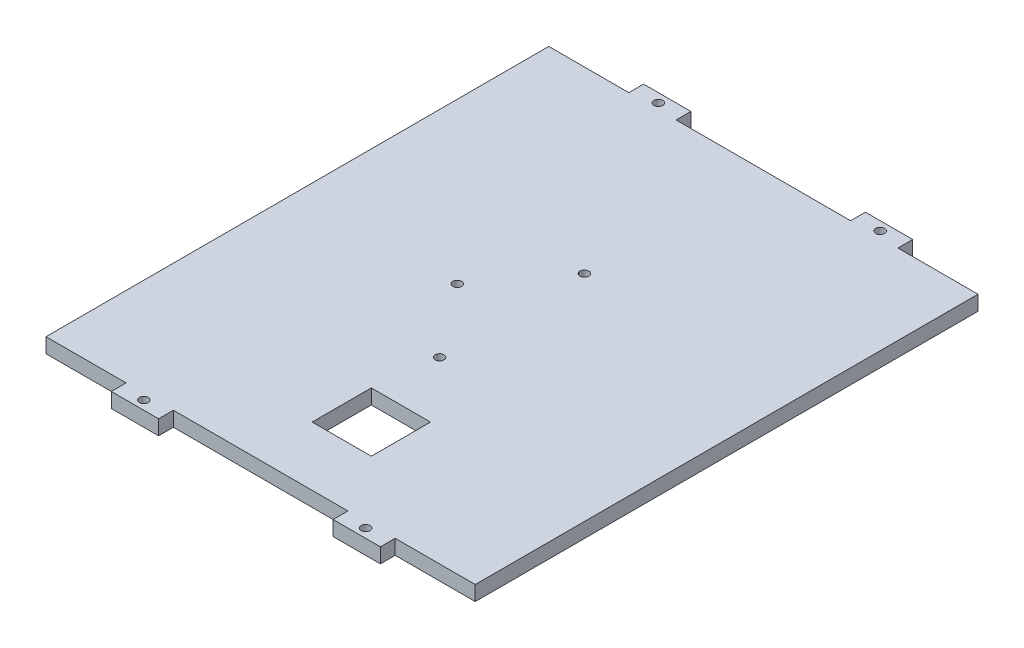
ISO-10303-21;
HEADER;
FILE_DESCRIPTION(('STEP AP214'),'2;1');
FILE_NAME('part.step','',(''),(''),'','','');
FILE_SCHEMA(('AUTOMOTIVE_DESIGN { 1 0 10303 214 1 1 1 1 }'));
ENDSEC;
DATA;
#1=APPLICATION_CONTEXT('core data for automotive mechanical design processes');
#2=APPLICATION_PROTOCOL_DEFINITION('international standard','automotive_design',2000,#1);
#3=PRODUCT_CONTEXT('',#1,'mechanical');
#4=PRODUCT('Part','Part','',(#3));
#5=PRODUCT_RELATED_PRODUCT_CATEGORY('part','',(#4));
#6=PRODUCT_DEFINITION_FORMATION('','',#4);
#7=PRODUCT_DEFINITION_CONTEXT('part definition',#1,'design');
#8=PRODUCT_DEFINITION('design','',#6,#7);
#9=PRODUCT_DEFINITION_SHAPE('','',#8);
#10=(LENGTH_UNIT() NAMED_UNIT(*) SI_UNIT(.MILLI.,.METRE.));
#11=(NAMED_UNIT(*) PLANE_ANGLE_UNIT() SI_UNIT($,.RADIAN.));
#12=(NAMED_UNIT(*) SI_UNIT($,.STERADIAN.) SOLID_ANGLE_UNIT());
#13=UNCERTAINTY_MEASURE_WITH_UNIT(LENGTH_MEASURE(1.E-05),#10,'distance_accuracy_value','');
#14=(GEOMETRIC_REPRESENTATION_CONTEXT(3) GLOBAL_UNCERTAINTY_ASSIGNED_CONTEXT((#13)) GLOBAL_UNIT_ASSIGNED_CONTEXT((#10,
#11,#12)) REPRESENTATION_CONTEXT('',''));
#15=CARTESIAN_POINT('',(0.,0.,0.));
#16=DIRECTION('',(0.,0.,1.));
#17=DIRECTION('',(1.,0.,0.));
#18=AXIS2_PLACEMENT_3D('',#15,#16,#17);
#19=CARTESIAN_POINT('',(0.,5.,0.));
#20=DIRECTION('',(0.,1.,0.));
#21=DIRECTION('',(0.,0.,1.));
#22=AXIS2_PLACEMENT_3D('',#19,#20,#21);
#23=PLANE('',#22);
#24=DIRECTION('',(0.,0.,1.));
#25=VECTOR('',#24,1.);
#26=CARTESIAN_POINT('',(-2.56999999999999,5.,45.));
#27=LINE('',#26,#25);
#28=CARTESIAN_POINT('',(-2.56999999999999,5.,45.));
#29=VERTEX_POINT('',#28);
#30=CARTESIAN_POINT('',(-2.56999999999999,5.,65.));
#31=VERTEX_POINT('',#30);
#32=EDGE_CURVE('E55',#29,#31,#27,.T.);
#33=ORIENTED_EDGE('',*,*,#32,.F.);
#34=DIRECTION('',(-1.,0.,0.));
#35=VECTOR('',#34,1.);
#36=CARTESIAN_POINT('',(-2.56999999999999,5.,45.));
#37=LINE('',#36,#35);
#38=CARTESIAN_POINT('',(17.43,5.,45.));
#39=VERTEX_POINT('',#38);
#40=EDGE_CURVE('E219',#39,#29,#37,.T.);
#41=ORIENTED_EDGE('',*,*,#40,.F.);
#42=DIRECTION('',(0.,0.,-1.));
#43=VECTOR('',#42,1.);
#44=CARTESIAN_POINT('',(17.43,5.,45.));
#45=LINE('',#44,#43);
#46=CARTESIAN_POINT('',(17.43,5.,65.));
#47=VERTEX_POINT('',#46);
#48=EDGE_CURVE('E222',#47,#39,#45,.T.);
#49=ORIENTED_EDGE('',*,*,#48,.F.);
#50=DIRECTION('',(1.,0.,0.));
#51=VECTOR('',#50,1.);
#52=CARTESIAN_POINT('',(-2.56999999999999,5.,65.));
#53=LINE('',#52,#51);
#54=EDGE_CURVE('E228',#31,#47,#53,.T.);
#55=ORIENTED_EDGE('',*,*,#54,.F.);
#56=EDGE_LOOP('',(#33,#41,#49,#55));
#57=FACE_BOUND('',#56,.T.);
#58=CARTESIAN_POINT('',(0.,5.,-24.5));
#59=DIRECTION('',(0.,1.,0.));
#60=DIRECTION('',(0.,0.,1.));
#61=AXIS2_PLACEMENT_3D('',#58,#59,#60);
#62=CIRCLE('',#61,1.5);
#63=CARTESIAN_POINT('',(0.,5.,-23.));
#64=VERTEX_POINT('',#63);
#65=EDGE_CURVE('E242',#64,#64,#62,.T.);
#66=ORIENTED_EDGE('',*,*,#65,.F.);
#67=EDGE_LOOP('',(#66));
#68=FACE_BOUND('',#67,.T.);
#69=CARTESIAN_POINT('',(0.,5.,24.5));
#70=DIRECTION('',(0.,1.,0.));
#71=DIRECTION('',(0.,0.,1.));
#72=AXIS2_PLACEMENT_3D('',#69,#70,#71);
#73=CIRCLE('',#72,1.5);
#74=CARTESIAN_POINT('',(0.,5.,26.));
#75=VERTEX_POINT('',#74);
#76=EDGE_CURVE('E248',#75,#75,#73,.T.);
#77=ORIENTED_EDGE('',*,*,#76,.F.);
#78=EDGE_LOOP('',(#77));
#79=FACE_BOUND('',#78,.T.);
#80=CARTESIAN_POINT('',(-18.5,5.,0.));
#81=DIRECTION('',(0.,1.,0.));
#82=DIRECTION('',(0.,0.,1.));
#83=AXIS2_PLACEMENT_3D('',#80,#81,#82);
#84=CIRCLE('',#83,1.5);
#85=CARTESIAN_POINT('',(-18.5,5.,1.5));
#86=VERTEX_POINT('',#85);
#87=EDGE_CURVE('E234',#86,#86,#84,.T.);
#88=ORIENTED_EDGE('',*,*,#87,.F.);
#89=EDGE_LOOP('',(#88));
#90=FACE_BOUND('',#89,.T.);
#91=CARTESIAN_POINT('',(-37.5,5.,87.));
#92=DIRECTION('',(0.,-1.,0.));
#93=DIRECTION('',(0.,0.,-1.));
#94=AXIS2_PLACEMENT_3D('',#91,#92,#93);
#95=CIRCLE('',#94,1.5);
#96=CARTESIAN_POINT('',(-37.5,5.,85.5));
#97=VERTEX_POINT('',#96);
#98=EDGE_CURVE('E241',#97,#97,#95,.T.);
#99=ORIENTED_EDGE('',*,*,#98,.T.);
#100=EDGE_LOOP('',(#99));
#101=FACE_BOUND('',#100,.T.);
#102=CARTESIAN_POINT('',(37.5,5.,87.));
#103=DIRECTION('',(0.,1.,0.));
#104=DIRECTION('',(0.,0.,-1.));
#105=AXIS2_PLACEMENT_3D('',#102,#103,#104);
#106=CIRCLE('',#105,1.5);
#107=CARTESIAN_POINT('',(37.5,5.,85.5));
#108=VERTEX_POINT('',#107);
#109=EDGE_CURVE('E259',#108,#108,#106,.T.);
#110=ORIENTED_EDGE('',*,*,#109,.F.);
#111=EDGE_LOOP('',(#110));
#112=FACE_BOUND('',#111,.T.);
#113=CARTESIAN_POINT('',(37.5,5.,-87.));
#114=DIRECTION('',(0.,-1.,0.));
#115=DIRECTION('',(0.,0.,1.));
#116=AXIS2_PLACEMENT_3D('',#113,#114,#115);
#117=CIRCLE('',#116,1.5);
#118=CARTESIAN_POINT('',(37.5,5.,-85.5));
#119=VERTEX_POINT('',#118);
#120=EDGE_CURVE('E265',#119,#119,#117,.T.);
#121=ORIENTED_EDGE('',*,*,#120,.T.);
#122=EDGE_LOOP('',(#121));
#123=FACE_BOUND('',#122,.T.);
#124=CARTESIAN_POINT('',(-37.5,5.,-87.));
#125=DIRECTION('',(0.,1.,0.));
#126=DIRECTION('',(0.,0.,1.));
#127=AXIS2_PLACEMENT_3D('',#124,#125,#126);
#128=CIRCLE('',#127,1.5);
#129=CARTESIAN_POINT('',(-37.5,5.,-85.5));
#130=VERTEX_POINT('',#129);
#131=EDGE_CURVE('E271',#130,#130,#128,.T.);
#132=ORIENTED_EDGE('',*,*,#131,.F.);
#133=EDGE_LOOP('',(#132));
#134=FACE_BOUND('',#133,.T.);
#135=DIRECTION('',(1.,0.,0.));
#136=VECTOR('',#135,1.);
#137=CARTESIAN_POINT('',(72.57,5.,90.));
#138=LINE('',#137,#136);
#139=CARTESIAN_POINT('',(29.5,5.,90.));
#140=VERTEX_POINT('',#139);
#141=CARTESIAN_POINT('',(45.5,5.,90.));
#142=VERTEX_POINT('',#141);
#143=EDGE_CURVE('E410',#140,#142,#138,.T.);
#144=ORIENTED_EDGE('',*,*,#143,.T.);
#145=DIRECTION('',(0.,0.,-1.));
#146=VECTOR('',#145,1.);
#147=CARTESIAN_POINT('',(45.5,5.,0.));
#148=LINE('',#147,#146);
#149=CARTESIAN_POINT('',(45.5,5.,85.));
#150=VERTEX_POINT('',#149);
#151=EDGE_CURVE('E277',#142,#150,#148,.T.);
#152=ORIENTED_EDGE('',*,*,#151,.T.);
#153=DIRECTION('',(1.,0.,0.));
#154=VECTOR('',#153,1.);
#155=CARTESIAN_POINT('',(0.,5.,85.));
#156=LINE('',#155,#154);
#157=CARTESIAN_POINT('',(72.57,5.,85.));
#158=VERTEX_POINT('',#157);
#159=EDGE_CURVE('E303',#150,#158,#156,.T.);
#160=ORIENTED_EDGE('',*,*,#159,.T.);
#161=DIRECTION('',(0.,0.,-1.));
#162=VECTOR('',#161,1.);
#163=CARTESIAN_POINT('',(72.57,5.,90.));
#164=LINE('',#163,#162);
#165=CARTESIAN_POINT('',(72.57,5.,-85.));
#166=VERTEX_POINT('',#165);
#167=EDGE_CURVE('E415',#158,#166,#164,.T.);
#168=ORIENTED_EDGE('',*,*,#167,.T.);
#169=DIRECTION('',(1.,0.,0.));
#170=VECTOR('',#169,1.);
#171=CARTESIAN_POINT('',(0.,5.,-85.));
#172=LINE('',#171,#170);
#173=CARTESIAN_POINT('',(45.5,5.,-85.));
#174=VERTEX_POINT('',#173);
#175=EDGE_CURVE('E367',#174,#166,#172,.T.);
#176=ORIENTED_EDGE('',*,*,#175,.F.);
#177=DIRECTION('',(0.,0.,1.));
#178=VECTOR('',#177,1.);
#179=CARTESIAN_POINT('',(45.5,5.,0.));
#180=LINE('',#179,#178);
#181=CARTESIAN_POINT('',(45.5,5.,-90.));
#182=VERTEX_POINT('',#181);
#183=EDGE_CURVE('E335',#182,#174,#180,.T.);
#184=ORIENTED_EDGE('',*,*,#183,.F.);
#185=DIRECTION('',(-1.,0.,0.));
#186=VECTOR('',#185,1.);
#187=CARTESIAN_POINT('',(72.57,5.,-90.));
#188=LINE('',#187,#186);
#189=CARTESIAN_POINT('',(29.5,5.,-90.));
#190=VERTEX_POINT('',#189);
#191=EDGE_CURVE('E11',#182,#190,#188,.T.);
#192=ORIENTED_EDGE('',*,*,#191,.T.);
#193=DIRECTION('',(0.,0.,1.));
#194=VECTOR('',#193,1.);
#195=CARTESIAN_POINT('',(29.5,5.,0.));
#196=LINE('',#195,#194);
#197=CARTESIAN_POINT('',(29.5,5.,-85.));
#198=VERTEX_POINT('',#197);
#199=EDGE_CURVE('E384',#190,#198,#196,.T.);
#200=ORIENTED_EDGE('',*,*,#199,.T.);
#201=DIRECTION('',(1.,0.,0.));
#202=VECTOR('',#201,1.);
#203=CARTESIAN_POINT('',(0.,5.,-85.));
#204=LINE('',#203,#202);
#205=CARTESIAN_POINT('',(-29.5,5.,-85.));
#206=VERTEX_POINT('',#205);
#207=EDGE_CURVE('E393',#206,#198,#204,.T.);
#208=ORIENTED_EDGE('',*,*,#207,.F.);
#209=DIRECTION('',(0.,0.,1.));
#210=VECTOR('',#209,1.);
#211=CARTESIAN_POINT('',(-29.5,5.,0.));
#212=LINE('',#211,#210);
#213=CARTESIAN_POINT('',(-29.5,5.,-90.));
#214=VERTEX_POINT('',#213);
#215=EDGE_CURVE('E359',#214,#206,#212,.T.);
#216=ORIENTED_EDGE('',*,*,#215,.F.);
#217=CARTESIAN_POINT('',(-45.5,5.,-90.));
#218=VERTEX_POINT('',#217);
#219=EDGE_CURVE('E47',#214,#218,#188,.T.);
#220=ORIENTED_EDGE('',*,*,#219,.T.);
#221=DIRECTION('',(0.,0.,1.));
#222=VECTOR('',#221,1.);
#223=CARTESIAN_POINT('',(-45.5,5.,0.));
#224=LINE('',#223,#222);
#225=CARTESIAN_POINT('',(-45.5,5.,-85.));
#226=VERTEX_POINT('',#225);
#227=EDGE_CURVE('E346',#218,#226,#224,.T.);
#228=ORIENTED_EDGE('',*,*,#227,.T.);
#229=DIRECTION('',(1.,0.,0.));
#230=VECTOR('',#229,1.);
#231=CARTESIAN_POINT('',(0.,5.,-85.));
#232=LINE('',#231,#230);
#233=CARTESIAN_POINT('',(-72.57,5.,-85.));
#234=VERTEX_POINT('',#233);
#235=EDGE_CURVE('E350',#234,#226,#232,.T.);
#236=ORIENTED_EDGE('',*,*,#235,.F.);
#237=DIRECTION('',(0.,0.,1.));
#238=VECTOR('',#237,1.);
#239=CARTESIAN_POINT('',(-72.57,5.,90.));
#240=LINE('',#239,#238);
#241=CARTESIAN_POINT('',(-72.57,5.,85.));
#242=VERTEX_POINT('',#241);
#243=EDGE_CURVE('E407',#234,#242,#240,.T.);
#244=ORIENTED_EDGE('',*,*,#243,.T.);
#245=DIRECTION('',(1.,0.,0.));
#246=VECTOR('',#245,1.);
#247=CARTESIAN_POINT('',(0.,5.,85.));
#248=LINE('',#247,#246);
#249=CARTESIAN_POINT('',(-45.5,5.,85.));
#250=VERTEX_POINT('',#249);
#251=EDGE_CURVE('E284',#242,#250,#248,.T.);
#252=ORIENTED_EDGE('',*,*,#251,.T.);
#253=DIRECTION('',(0.,0.,-1.));
#254=VECTOR('',#253,1.);
#255=CARTESIAN_POINT('',(-45.5,5.,0.));
#256=LINE('',#255,#254);
#257=CARTESIAN_POINT('',(-45.5,5.,90.));
#258=VERTEX_POINT('',#257);
#259=EDGE_CURVE('E287',#258,#250,#256,.T.);
#260=ORIENTED_EDGE('',*,*,#259,.F.);
#261=CARTESIAN_POINT('',(-29.5,5.,90.));
#262=VERTEX_POINT('',#261);
#263=EDGE_CURVE('E414',#258,#262,#138,.T.);
#264=ORIENTED_EDGE('',*,*,#263,.T.);
#265=DIRECTION('',(0.,0.,-1.));
#266=VECTOR('',#265,1.);
#267=CARTESIAN_POINT('',(-29.5,5.,0.));
#268=LINE('',#267,#266);
#269=CARTESIAN_POINT('',(-29.5,5.,85.));
#270=VERTEX_POINT('',#269);
#271=EDGE_CURVE('E296',#262,#270,#268,.T.);
#272=ORIENTED_EDGE('',*,*,#271,.T.);
#273=DIRECTION('',(1.,0.,0.));
#274=VECTOR('',#273,1.);
#275=CARTESIAN_POINT('',(0.,5.,85.));
#276=LINE('',#275,#274);
#277=CARTESIAN_POINT('',(29.5,5.,85.));
#278=VERTEX_POINT('',#277);
#279=EDGE_CURVE('E319',#270,#278,#276,.T.);
#280=ORIENTED_EDGE('',*,*,#279,.T.);
#281=DIRECTION('',(0.,0.,-1.));
#282=VECTOR('',#281,1.);
#283=CARTESIAN_POINT('',(29.5,5.,0.));
#284=LINE('',#283,#282);
#285=EDGE_CURVE('E327',#140,#278,#284,.T.);
#286=ORIENTED_EDGE('',*,*,#285,.F.);
#287=EDGE_LOOP('',(#144,#152,#160,#168,#176,#184,#192,#200,#208,#216,#220,#228,#236,#244,#252,
#260,#264,#272,#280,#286));
#288=FACE_BOUND('',#287,.T.);
#289=ADVANCED_FACE('F38',(#57,#68,#79,#90,#101,#112,#123,#134,#288),#23,.T.);
#290=CARTESIAN_POINT('',(0.,0.,0.));
#291=DIRECTION('',(0.,1.,0.));
#292=DIRECTION('',(0.,0.,1.));
#293=AXIS2_PLACEMENT_3D('',#290,#291,#292);
#294=PLANE('',#293);
#295=DIRECTION('',(-1.,0.,0.));
#296=VECTOR('',#295,1.);
#297=CARTESIAN_POINT('',(-2.56999999999999,0.,45.));
#298=LINE('',#297,#296);
#299=CARTESIAN_POINT('',(17.43,0.,45.));
#300=VERTEX_POINT('',#299);
#301=CARTESIAN_POINT('',(-2.56999999999999,0.,45.));
#302=VERTEX_POINT('',#301);
#303=EDGE_CURVE('E209',#300,#302,#298,.T.);
#304=ORIENTED_EDGE('',*,*,#303,.T.);
#305=DIRECTION('',(0.,0.,1.));
#306=VECTOR('',#305,1.);
#307=CARTESIAN_POINT('',(-2.56999999999999,0.,45.));
#308=LINE('',#307,#306);
#309=CARTESIAN_POINT('',(-2.56999999999999,0.,65.));
#310=VERTEX_POINT('',#309);
#311=EDGE_CURVE('E203',#302,#310,#308,.T.);
#312=ORIENTED_EDGE('',*,*,#311,.T.);
#313=DIRECTION('',(1.,0.,0.));
#314=VECTOR('',#313,1.);
#315=CARTESIAN_POINT('',(-2.56999999999999,0.,65.));
#316=LINE('',#315,#314);
#317=CARTESIAN_POINT('',(17.43,0.,65.));
#318=VERTEX_POINT('',#317);
#319=EDGE_CURVE('E212',#310,#318,#316,.T.);
#320=ORIENTED_EDGE('',*,*,#319,.T.);
#321=DIRECTION('',(0.,0.,-1.));
#322=VECTOR('',#321,1.);
#323=CARTESIAN_POINT('',(17.43,0.,45.));
#324=LINE('',#323,#322);
#325=EDGE_CURVE('E63',#318,#300,#324,.T.);
#326=ORIENTED_EDGE('',*,*,#325,.T.);
#327=EDGE_LOOP('',(#304,#312,#320,#326));
#328=FACE_BOUND('',#327,.T.);
#329=CARTESIAN_POINT('',(0.,0.,-24.5));
#330=DIRECTION('',(0.,1.,0.));
#331=DIRECTION('',(0.,0.,1.));
#332=AXIS2_PLACEMENT_3D('',#329,#330,#331);
#333=CIRCLE('',#332,1.5);
#334=CARTESIAN_POINT('',(0.,0.,-23.));
#335=VERTEX_POINT('',#334);
#336=EDGE_CURVE('E238',#335,#335,#333,.T.);
#337=ORIENTED_EDGE('',*,*,#336,.T.);
#338=EDGE_LOOP('',(#337));
#339=FACE_BOUND('',#338,.T.);
#340=CARTESIAN_POINT('',(0.,0.,24.5));
#341=DIRECTION('',(0.,1.,0.));
#342=DIRECTION('',(0.,0.,1.));
#343=AXIS2_PLACEMENT_3D('',#340,#341,#342);
#344=CIRCLE('',#343,1.5);
#345=CARTESIAN_POINT('',(0.,0.,26.));
#346=VERTEX_POINT('',#345);
#347=EDGE_CURVE('E245',#346,#346,#344,.T.);
#348=ORIENTED_EDGE('',*,*,#347,.T.);
#349=EDGE_LOOP('',(#348));
#350=FACE_BOUND('',#349,.T.);
#351=CARTESIAN_POINT('',(-18.5,0.,0.));
#352=DIRECTION('',(0.,1.,0.));
#353=DIRECTION('',(0.,0.,1.));
#354=AXIS2_PLACEMENT_3D('',#351,#352,#353);
#355=CIRCLE('',#354,1.5);
#356=CARTESIAN_POINT('',(-18.5,0.,1.5));
#357=VERTEX_POINT('',#356);
#358=EDGE_CURVE('E251',#357,#357,#355,.T.);
#359=ORIENTED_EDGE('',*,*,#358,.T.);
#360=EDGE_LOOP('',(#359));
#361=FACE_BOUND('',#360,.T.);
#362=CARTESIAN_POINT('',(-37.5,0.,87.));
#363=DIRECTION('',(0.,-1.,0.));
#364=DIRECTION('',(0.,0.,-1.));
#365=AXIS2_PLACEMENT_3D('',#362,#363,#364);
#366=CIRCLE('',#365,1.5);
#367=CARTESIAN_POINT('',(-37.5,0.,85.5));
#368=VERTEX_POINT('',#367);
#369=EDGE_CURVE('E256',#368,#368,#366,.T.);
#370=ORIENTED_EDGE('',*,*,#369,.F.);
#371=EDGE_LOOP('',(#370));
#372=FACE_BOUND('',#371,.T.);
#373=CARTESIAN_POINT('',(37.5,0.,87.));
#374=DIRECTION('',(0.,1.,0.));
#375=DIRECTION('',(0.,0.,-1.));
#376=AXIS2_PLACEMENT_3D('',#373,#374,#375);
#377=CIRCLE('',#376,1.5);
#378=CARTESIAN_POINT('',(37.5,0.,85.5));
#379=VERTEX_POINT('',#378);
#380=EDGE_CURVE('E262',#379,#379,#377,.T.);
#381=ORIENTED_EDGE('',*,*,#380,.T.);
#382=EDGE_LOOP('',(#381));
#383=FACE_BOUND('',#382,.T.);
#384=CARTESIAN_POINT('',(37.5,0.,-87.));
#385=DIRECTION('',(0.,-1.,0.));
#386=DIRECTION('',(0.,0.,1.));
#387=AXIS2_PLACEMENT_3D('',#384,#385,#386);
#388=CIRCLE('',#387,1.5);
#389=CARTESIAN_POINT('',(37.5,0.,-85.5));
#390=VERTEX_POINT('',#389);
#391=EDGE_CURVE('E268',#390,#390,#388,.T.);
#392=ORIENTED_EDGE('',*,*,#391,.F.);
#393=EDGE_LOOP('',(#392));
#394=FACE_BOUND('',#393,.T.);
#395=CARTESIAN_POINT('',(-37.5,0.,-87.));
#396=DIRECTION('',(0.,1.,0.));
#397=DIRECTION('',(0.,0.,1.));
#398=AXIS2_PLACEMENT_3D('',#395,#396,#397);
#399=CIRCLE('',#398,1.5);
#400=CARTESIAN_POINT('',(-37.5,0.,-85.5));
#401=VERTEX_POINT('',#400);
#402=EDGE_CURVE('E274',#401,#401,#399,.T.);
#403=ORIENTED_EDGE('',*,*,#402,.T.);
#404=EDGE_LOOP('',(#403));
#405=FACE_BOUND('',#404,.T.);
#406=DIRECTION('',(0.,0.,-1.));
#407=VECTOR('',#406,1.);
#408=CARTESIAN_POINT('',(45.5,0.,0.));
#409=LINE('',#408,#407);
#410=CARTESIAN_POINT('',(45.5,0.,90.));
#411=VERTEX_POINT('',#410);
#412=CARTESIAN_POINT('',(45.5,0.,85.));
#413=VERTEX_POINT('',#412);
#414=EDGE_CURVE('E300',#411,#413,#409,.T.);
#415=ORIENTED_EDGE('',*,*,#414,.F.);
#416=DIRECTION('',(1.,0.,0.));
#417=VECTOR('',#416,1.);
#418=CARTESIAN_POINT('',(72.57,0.,90.));
#419=LINE('',#418,#417);
#420=CARTESIAN_POINT('',(29.5,0.,90.));
#421=VERTEX_POINT('',#420);
#422=EDGE_CURVE('E420',#421,#411,#419,.T.);
#423=ORIENTED_EDGE('',*,*,#422,.F.);
#424=DIRECTION('',(0.,0.,-1.));
#425=VECTOR('',#424,1.);
#426=CARTESIAN_POINT('',(29.5,0.,0.));
#427=LINE('',#426,#425);
#428=CARTESIAN_POINT('',(29.5,0.,85.));
#429=VERTEX_POINT('',#428);
#430=EDGE_CURVE('E318',#421,#429,#427,.T.);
#431=ORIENTED_EDGE('',*,*,#430,.T.);
#432=DIRECTION('',(1.,0.,0.));
#433=VECTOR('',#432,1.);
#434=CARTESIAN_POINT('',(0.,0.,85.));
#435=LINE('',#434,#433);
#436=CARTESIAN_POINT('',(-29.5,0.,85.));
#437=VERTEX_POINT('',#436);
#438=EDGE_CURVE('E322',#437,#429,#435,.T.);
#439=ORIENTED_EDGE('',*,*,#438,.F.);
#440=DIRECTION('',(0.,0.,-1.));
#441=VECTOR('',#440,1.);
#442=CARTESIAN_POINT('',(-29.5,0.,0.));
#443=LINE('',#442,#441);
#444=CARTESIAN_POINT('',(-29.5,0.,90.));
#445=VERTEX_POINT('',#444);
#446=EDGE_CURVE('E316',#445,#437,#443,.T.);
#447=ORIENTED_EDGE('',*,*,#446,.F.);
#448=CARTESIAN_POINT('',(-45.5,0.,90.));
#449=VERTEX_POINT('',#448);
#450=EDGE_CURVE('E422',#449,#445,#419,.T.);
#451=ORIENTED_EDGE('',*,*,#450,.F.);
#452=DIRECTION('',(0.,0.,-1.));
#453=VECTOR('',#452,1.);
#454=CARTESIAN_POINT('',(-45.5,0.,0.));
#455=LINE('',#454,#453);
#456=CARTESIAN_POINT('',(-45.5,0.,85.));
#457=VERTEX_POINT('',#456);
#458=EDGE_CURVE('E280',#449,#457,#455,.T.);
#459=ORIENTED_EDGE('',*,*,#458,.T.);
#460=DIRECTION('',(1.,0.,0.));
#461=VECTOR('',#460,1.);
#462=CARTESIAN_POINT('',(0.,0.,85.));
#463=LINE('',#462,#461);
#464=CARTESIAN_POINT('',(-72.57,0.,85.));
#465=VERTEX_POINT('',#464);
#466=EDGE_CURVE('E283',#465,#457,#463,.T.);
#467=ORIENTED_EDGE('',*,*,#466,.F.);
#468=DIRECTION('',(0.,0.,1.));
#469=VECTOR('',#468,1.);
#470=CARTESIAN_POINT('',(-72.57,0.,90.));
#471=LINE('',#470,#469);
#472=CARTESIAN_POINT('',(-72.57,0.,-85.));
#473=VERTEX_POINT('',#472);
#474=EDGE_CURVE('E400',#473,#465,#471,.T.);
#475=ORIENTED_EDGE('',*,*,#474,.F.);
#476=DIRECTION('',(1.,0.,0.));
#477=VECTOR('',#476,1.);
#478=CARTESIAN_POINT('',(0.,0.,-85.));
#479=LINE('',#478,#477);
#480=CARTESIAN_POINT('',(-45.5,0.,-85.));
#481=VERTEX_POINT('',#480);
#482=EDGE_CURVE('E342',#473,#481,#479,.T.);
#483=ORIENTED_EDGE('',*,*,#482,.T.);
#484=DIRECTION('',(0.,0.,1.));
#485=VECTOR('',#484,1.);
#486=CARTESIAN_POINT('',(-45.5,0.,0.));
#487=LINE('',#486,#485);
#488=CARTESIAN_POINT('',(-45.5,0.,-90.));
#489=VERTEX_POINT('',#488);
#490=EDGE_CURVE('E345',#489,#481,#487,.T.);
#491=ORIENTED_EDGE('',*,*,#490,.F.);
#492=DIRECTION('',(-1.,0.,0.));
#493=VECTOR('',#492,1.);
#494=CARTESIAN_POINT('',(72.57,0.,-90.));
#495=LINE('',#494,#493);
#496=CARTESIAN_POINT('',(-29.5,0.,-90.));
#497=VERTEX_POINT('',#496);
#498=EDGE_CURVE('E42',#497,#489,#495,.T.);
#499=ORIENTED_EDGE('',*,*,#498,.F.);
#500=DIRECTION('',(0.,0.,1.));
#501=VECTOR('',#500,1.);
#502=CARTESIAN_POINT('',(-29.5,0.,0.));
#503=LINE('',#502,#501);
#504=CARTESIAN_POINT('',(-29.5,0.,-85.));
#505=VERTEX_POINT('',#504);
#506=EDGE_CURVE('E380',#497,#505,#503,.T.);
#507=ORIENTED_EDGE('',*,*,#506,.T.);
#508=DIRECTION('',(1.,0.,0.));
#509=VECTOR('',#508,1.);
#510=CARTESIAN_POINT('',(0.,0.,-85.));
#511=LINE('',#510,#509);
#512=CARTESIAN_POINT('',(29.5,0.,-85.));
#513=VERTEX_POINT('',#512);
#514=EDGE_CURVE('E383',#505,#513,#511,.T.);
#515=ORIENTED_EDGE('',*,*,#514,.T.);
#516=DIRECTION('',(0.,0.,1.));
#517=VECTOR('',#516,1.);
#518=CARTESIAN_POINT('',(29.5,0.,0.));
#519=LINE('',#518,#517);
#520=CARTESIAN_POINT('',(29.5,0.,-90.));
#521=VERTEX_POINT('',#520);
#522=EDGE_CURVE('E387',#521,#513,#519,.T.);
#523=ORIENTED_EDGE('',*,*,#522,.F.);
#524=CARTESIAN_POINT('',(45.5,0.,-90.));
#525=VERTEX_POINT('',#524);
#526=EDGE_CURVE('E411',#525,#521,#495,.T.);
#527=ORIENTED_EDGE('',*,*,#526,.F.);
#528=DIRECTION('',(0.,0.,1.));
#529=VECTOR('',#528,1.);
#530=CARTESIAN_POINT('',(45.5,0.,0.));
#531=LINE('',#530,#529);
#532=CARTESIAN_POINT('',(45.5,0.,-85.));
#533=VERTEX_POINT('',#532);
#534=EDGE_CURVE('E363',#525,#533,#531,.T.);
#535=ORIENTED_EDGE('',*,*,#534,.T.);
#536=DIRECTION('',(1.,0.,0.));
#537=VECTOR('',#536,1.);
#538=CARTESIAN_POINT('',(0.,0.,-85.));
#539=LINE('',#538,#537);
#540=CARTESIAN_POINT('',(72.57,0.,-85.));
#541=VERTEX_POINT('',#540);
#542=EDGE_CURVE('E366',#533,#541,#539,.T.);
#543=ORIENTED_EDGE('',*,*,#542,.T.);
#544=DIRECTION('',(0.,0.,-1.));
#545=VECTOR('',#544,1.);
#546=CARTESIAN_POINT('',(72.57,0.,90.));
#547=LINE('',#546,#545);
#548=CARTESIAN_POINT('',(72.57,0.,85.));
#549=VERTEX_POINT('',#548);
#550=EDGE_CURVE('E423',#549,#541,#547,.T.);
#551=ORIENTED_EDGE('',*,*,#550,.F.);
#552=DIRECTION('',(1.,0.,0.));
#553=VECTOR('',#552,1.);
#554=CARTESIAN_POINT('',(0.,0.,85.));
#555=LINE('',#554,#553);
#556=EDGE_CURVE('E302',#413,#549,#555,.T.);
#557=ORIENTED_EDGE('',*,*,#556,.F.);
#558=EDGE_LOOP('',(#415,#423,#431,#439,#447,#451,#459,#467,#475,#483,#491,#499,#507,#515,#523,
#527,#535,#543,#551,#557));
#559=FACE_BOUND('',#558,.T.);
#560=ADVANCED_FACE('F216',(#328,#339,#350,#361,#372,#383,#394,#405,#559),#294,.F.);
#561=CARTESIAN_POINT('',(-72.57,5.,90.));
#562=DIRECTION('',(1.,0.,0.));
#563=DIRECTION('',(0.,0.,-1.));
#564=AXIS2_PLACEMENT_3D('',#561,#562,#563);
#565=PLANE('',#564);
#566=DIRECTION('',(0.,1.,0.));
#567=VECTOR('',#566,1.);
#568=CARTESIAN_POINT('',(-72.57,0.,85.));
#569=LINE('',#568,#567);
#570=EDGE_CURVE('E293',#465,#242,#569,.T.);
#571=ORIENTED_EDGE('',*,*,#570,.T.);
#572=ORIENTED_EDGE('',*,*,#243,.F.);
#573=DIRECTION('',(0.,1.,0.));
#574=VECTOR('',#573,1.);
#575=CARTESIAN_POINT('',(-72.57,0.,-85.));
#576=LINE('',#575,#574);
#577=EDGE_CURVE('E349',#473,#234,#576,.T.);
#578=ORIENTED_EDGE('',*,*,#577,.F.);
#579=ORIENTED_EDGE('',*,*,#474,.T.);
#580=EDGE_LOOP('',(#571,#572,#578,#579));
#581=FACE_BOUND('',#580,.T.);
#582=ADVANCED_FACE('F40',(#581),#565,.F.);
#583=CARTESIAN_POINT('',(72.57,5.,90.));
#584=DIRECTION('',(0.,0.,-1.));
#585=DIRECTION('',(-1.,0.,0.));
#586=AXIS2_PLACEMENT_3D('',#583,#584,#585);
#587=PLANE('',#586);
#588=DIRECTION('',(0.,1.,0.));
#589=VECTOR('',#588,1.);
#590=CARTESIAN_POINT('',(45.5,0.,90.));
#591=LINE('',#590,#589);
#592=EDGE_CURVE('E305',#411,#142,#591,.T.);
#593=ORIENTED_EDGE('',*,*,#592,.T.);
#594=ORIENTED_EDGE('',*,*,#143,.F.);
#595=DIRECTION('',(0.,1.,0.));
#596=VECTOR('',#595,1.);
#597=CARTESIAN_POINT('',(29.5,0.,90.));
#598=LINE('',#597,#596);
#599=EDGE_CURVE('E338',#421,#140,#598,.T.);
#600=ORIENTED_EDGE('',*,*,#599,.F.);
#601=ORIENTED_EDGE('',*,*,#422,.T.);
#602=EDGE_LOOP('',(#593,#594,#600,#601));
#603=FACE_BOUND('',#602,.T.);
#604=ADVANCED_FACE('F505',(#603),#587,.F.);
#605=ORIENTED_EDGE('',*,*,#263,.F.);
#606=DIRECTION('',(0.,1.,0.));
#607=VECTOR('',#606,1.);
#608=CARTESIAN_POINT('',(-45.5,0.,90.));
#609=LINE('',#608,#607);
#610=EDGE_CURVE('E286',#449,#258,#609,.T.);
#611=ORIENTED_EDGE('',*,*,#610,.F.);
#612=ORIENTED_EDGE('',*,*,#450,.T.);
#613=DIRECTION('',(0.,1.,0.));
#614=VECTOR('',#613,1.);
#615=CARTESIAN_POINT('',(-29.5,0.,90.));
#616=LINE('',#615,#614);
#617=EDGE_CURVE('E324',#445,#262,#616,.T.);
#618=ORIENTED_EDGE('',*,*,#617,.T.);
#619=EDGE_LOOP('',(#605,#611,#612,#618));
#620=FACE_BOUND('',#619,.T.);
#621=ADVANCED_FACE('F434',(#620),#587,.F.);
#622=CARTESIAN_POINT('',(72.57,5.,90.));
#623=DIRECTION('',(-1.,0.,0.));
#624=DIRECTION('',(0.,0.,1.));
#625=AXIS2_PLACEMENT_3D('',#622,#623,#624);
#626=PLANE('',#625);
#627=DIRECTION('',(0.,1.,0.));
#628=VECTOR('',#627,1.);
#629=CARTESIAN_POINT('',(72.57,0.,85.));
#630=LINE('',#629,#628);
#631=EDGE_CURVE('E312',#549,#158,#630,.T.);
#632=ORIENTED_EDGE('',*,*,#631,.F.);
#633=ORIENTED_EDGE('',*,*,#550,.T.);
#634=DIRECTION('',(0.,1.,0.));
#635=VECTOR('',#634,1.);
#636=CARTESIAN_POINT('',(72.57,0.,-85.));
#637=LINE('',#636,#635);
#638=EDGE_CURVE('E376',#541,#166,#637,.T.);
#639=ORIENTED_EDGE('',*,*,#638,.T.);
#640=ORIENTED_EDGE('',*,*,#167,.F.);
#641=EDGE_LOOP('',(#632,#633,#639,#640));
#642=FACE_BOUND('',#641,.T.);
#643=ADVANCED_FACE('F495',(#642),#626,.F.);
#644=CARTESIAN_POINT('',(72.57,5.,-90.));
#645=DIRECTION('',(0.,0.,1.));
#646=DIRECTION('',(1.,0.,0.));
#647=AXIS2_PLACEMENT_3D('',#644,#645,#646);
#648=PLANE('',#647);
#649=DIRECTION('',(0.,1.,0.));
#650=VECTOR('',#649,1.);
#651=CARTESIAN_POINT('',(-45.5,0.,-90.));
#652=LINE('',#651,#650);
#653=EDGE_CURVE('E356',#489,#218,#652,.T.);
#654=ORIENTED_EDGE('',*,*,#653,.T.);
#655=ORIENTED_EDGE('',*,*,#219,.F.);
#656=DIRECTION('',(0.,1.,0.));
#657=VECTOR('',#656,1.);
#658=CARTESIAN_POINT('',(-29.5,0.,-90.));
#659=LINE('',#658,#657);
#660=EDGE_CURVE('E398',#497,#214,#659,.T.);
#661=ORIENTED_EDGE('',*,*,#660,.F.);
#662=ORIENTED_EDGE('',*,*,#498,.T.);
#663=EDGE_LOOP('',(#654,#655,#661,#662));
#664=FACE_BOUND('',#663,.T.);
#665=ADVANCED_FACE('F469',(#664),#648,.F.);
#666=ORIENTED_EDGE('',*,*,#191,.F.);
#667=DIRECTION('',(0.,1.,0.));
#668=VECTOR('',#667,1.);
#669=CARTESIAN_POINT('',(45.5,0.,-90.));
#670=LINE('',#669,#668);
#671=EDGE_CURVE('E353',#525,#182,#670,.T.);
#672=ORIENTED_EDGE('',*,*,#671,.F.);
#673=ORIENTED_EDGE('',*,*,#526,.T.);
#674=DIRECTION('',(0.,1.,0.));
#675=VECTOR('',#674,1.);
#676=CARTESIAN_POINT('',(29.5,0.,-90.));
#677=LINE('',#676,#675);
#678=EDGE_CURVE('E401',#521,#190,#677,.T.);
#679=ORIENTED_EDGE('',*,*,#678,.T.);
#680=EDGE_LOOP('',(#666,#672,#673,#679));
#681=FACE_BOUND('',#680,.T.);
#682=ADVANCED_FACE('F486',(#681),#648,.F.);
#683=CARTESIAN_POINT('',(-29.5,0.,0.));
#684=DIRECTION('',(-1.,0.,0.));
#685=DIRECTION('',(0.,0.,1.));
#686=AXIS2_PLACEMENT_3D('',#683,#684,#685);
#687=PLANE('',#686);
#688=ORIENTED_EDGE('',*,*,#215,.T.);
#689=DIRECTION('',(0.,1.,0.));
#690=VECTOR('',#689,1.);
#691=CARTESIAN_POINT('',(-29.5,0.,-85.));
#692=LINE('',#691,#690);
#693=EDGE_CURVE('E390',#505,#206,#692,.T.);
#694=ORIENTED_EDGE('',*,*,#693,.F.);
#695=ORIENTED_EDGE('',*,*,#506,.F.);
#696=ORIENTED_EDGE('',*,*,#660,.T.);
#697=EDGE_LOOP('',(#688,#694,#695,#696));
#698=FACE_BOUND('',#697,.T.);
#699=ADVANCED_FACE('F475',(#698),#687,.F.);
#700=CARTESIAN_POINT('',(29.5,0.,0.));
#701=DIRECTION('',(-1.,0.,0.));
#702=DIRECTION('',(0.,0.,1.));
#703=AXIS2_PLACEMENT_3D('',#700,#701,#702);
#704=PLANE('',#703);
#705=ORIENTED_EDGE('',*,*,#199,.F.);
#706=ORIENTED_EDGE('',*,*,#678,.F.);
#707=ORIENTED_EDGE('',*,*,#522,.T.);
#708=DIRECTION('',(0.,1.,0.));
#709=VECTOR('',#708,1.);
#710=CARTESIAN_POINT('',(29.5,0.,-85.));
#711=LINE('',#710,#709);
#712=EDGE_CURVE('E404',#513,#198,#711,.T.);
#713=ORIENTED_EDGE('',*,*,#712,.T.);
#714=EDGE_LOOP('',(#705,#706,#707,#713));
#715=FACE_BOUND('',#714,.T.);
#716=ADVANCED_FACE('F480',(#715),#704,.T.);
#717=CARTESIAN_POINT('',(0.,0.,-85.));
#718=DIRECTION('',(0.,0.,1.));
#719=DIRECTION('',(1.,0.,0.));
#720=AXIS2_PLACEMENT_3D('',#717,#718,#719);
#721=PLANE('',#720);
#722=ORIENTED_EDGE('',*,*,#207,.T.);
#723=ORIENTED_EDGE('',*,*,#712,.F.);
#724=ORIENTED_EDGE('',*,*,#514,.F.);
#725=ORIENTED_EDGE('',*,*,#693,.T.);
#726=EDGE_LOOP('',(#722,#723,#724,#725));
#727=FACE_BOUND('',#726,.T.);
#728=ADVANCED_FACE('F478',(#727),#721,.F.);
#729=CARTESIAN_POINT('',(-45.5,0.,0.));
#730=DIRECTION('',(-1.,0.,0.));
#731=DIRECTION('',(0.,0.,1.));
#732=AXIS2_PLACEMENT_3D('',#729,#730,#731);
#733=PLANE('',#732);
#734=ORIENTED_EDGE('',*,*,#227,.F.);
#735=ORIENTED_EDGE('',*,*,#653,.F.);
#736=ORIENTED_EDGE('',*,*,#490,.T.);
#737=DIRECTION('',(0.,1.,0.));
#738=VECTOR('',#737,1.);
#739=CARTESIAN_POINT('',(-45.5,0.,-85.));
#740=LINE('',#739,#738);
#741=EDGE_CURVE('E360',#481,#226,#740,.T.);
#742=ORIENTED_EDGE('',*,*,#741,.T.);
#743=EDGE_LOOP('',(#734,#735,#736,#742));
#744=FACE_BOUND('',#743,.T.);
#745=ADVANCED_FACE('F466',(#744),#733,.T.);
#746=CARTESIAN_POINT('',(0.,0.,-85.));
#747=DIRECTION('',(0.,0.,1.));
#748=DIRECTION('',(1.,0.,0.));
#749=AXIS2_PLACEMENT_3D('',#746,#747,#748);
#750=PLANE('',#749);
#751=ORIENTED_EDGE('',*,*,#235,.T.);
#752=ORIENTED_EDGE('',*,*,#741,.F.);
#753=ORIENTED_EDGE('',*,*,#482,.F.);
#754=ORIENTED_EDGE('',*,*,#577,.T.);
#755=EDGE_LOOP('',(#751,#752,#753,#754));
#756=FACE_BOUND('',#755,.T.);
#757=ADVANCED_FACE('F462',(#756),#750,.F.);
#758=CARTESIAN_POINT('',(45.5,0.,0.));
#759=DIRECTION('',(-1.,0.,0.));
#760=DIRECTION('',(0.,0.,1.));
#761=AXIS2_PLACEMENT_3D('',#758,#759,#760);
#762=PLANE('',#761);
#763=ORIENTED_EDGE('',*,*,#183,.T.);
#764=DIRECTION('',(0.,1.,0.));
#765=VECTOR('',#764,1.);
#766=CARTESIAN_POINT('',(45.5,0.,-85.));
#767=LINE('',#766,#765);
#768=EDGE_CURVE('E370',#533,#174,#767,.T.);
#769=ORIENTED_EDGE('',*,*,#768,.F.);
#770=ORIENTED_EDGE('',*,*,#534,.F.);
#771=ORIENTED_EDGE('',*,*,#671,.T.);
#772=EDGE_LOOP('',(#763,#769,#770,#771));
#773=FACE_BOUND('',#772,.T.);
#774=ADVANCED_FACE('F489',(#773),#762,.F.);
#775=CARTESIAN_POINT('',(0.,0.,-85.));
#776=DIRECTION('',(0.,0.,1.));
#777=DIRECTION('',(1.,0.,0.));
#778=AXIS2_PLACEMENT_3D('',#775,#776,#777);
#779=PLANE('',#778);
#780=ORIENTED_EDGE('',*,*,#175,.T.);
#781=ORIENTED_EDGE('',*,*,#638,.F.);
#782=ORIENTED_EDGE('',*,*,#542,.F.);
#783=ORIENTED_EDGE('',*,*,#768,.T.);
#784=EDGE_LOOP('',(#780,#781,#782,#783));
#785=FACE_BOUND('',#784,.T.);
#786=ADVANCED_FACE('F493',(#785),#779,.F.);
#787=CARTESIAN_POINT('',(45.5,0.,0.));
#788=DIRECTION('',(1.,0.,0.));
#789=DIRECTION('',(0.,0.,-1.));
#790=AXIS2_PLACEMENT_3D('',#787,#788,#789);
#791=PLANE('',#790);
#792=ORIENTED_EDGE('',*,*,#151,.F.);
#793=ORIENTED_EDGE('',*,*,#592,.F.);
#794=ORIENTED_EDGE('',*,*,#414,.T.);
#795=DIRECTION('',(0.,1.,0.));
#796=VECTOR('',#795,1.);
#797=CARTESIAN_POINT('',(45.5,0.,85.));
#798=LINE('',#797,#796);
#799=EDGE_CURVE('E290',#413,#150,#798,.T.);
#800=ORIENTED_EDGE('',*,*,#799,.T.);
#801=EDGE_LOOP('',(#792,#793,#794,#800));
#802=FACE_BOUND('',#801,.T.);
#803=ADVANCED_FACE('F502',(#802),#791,.T.);
#804=CARTESIAN_POINT('',(0.,0.,85.));
#805=DIRECTION('',(0.,0.,1.));
#806=DIRECTION('',(1.,0.,0.));
#807=AXIS2_PLACEMENT_3D('',#804,#805,#806);
#808=PLANE('',#807);
#809=ORIENTED_EDGE('',*,*,#159,.F.);
#810=ORIENTED_EDGE('',*,*,#799,.F.);
#811=ORIENTED_EDGE('',*,*,#556,.T.);
#812=ORIENTED_EDGE('',*,*,#631,.T.);
#813=EDGE_LOOP('',(#809,#810,#811,#812));
#814=FACE_BOUND('',#813,.T.);
#815=ADVANCED_FACE('F500',(#814),#808,.T.);
#816=CARTESIAN_POINT('',(-29.5,0.,0.));
#817=DIRECTION('',(1.,0.,0.));
#818=DIRECTION('',(0.,0.,-1.));
#819=AXIS2_PLACEMENT_3D('',#816,#817,#818);
#820=PLANE('',#819);
#821=ORIENTED_EDGE('',*,*,#271,.F.);
#822=ORIENTED_EDGE('',*,*,#617,.F.);
#823=ORIENTED_EDGE('',*,*,#446,.T.);
#824=DIRECTION('',(0.,1.,0.));
#825=VECTOR('',#824,1.);
#826=CARTESIAN_POINT('',(-29.5,0.,85.));
#827=LINE('',#826,#825);
#828=EDGE_CURVE('E332',#437,#270,#827,.T.);
#829=ORIENTED_EDGE('',*,*,#828,.T.);
#830=EDGE_LOOP('',(#821,#822,#823,#829));
#831=FACE_BOUND('',#830,.T.);
#832=ADVANCED_FACE('F443',(#831),#820,.T.);
#833=CARTESIAN_POINT('',(0.,0.,85.));
#834=DIRECTION('',(0.,0.,1.));
#835=DIRECTION('',(1.,0.,0.));
#836=AXIS2_PLACEMENT_3D('',#833,#834,#835);
#837=PLANE('',#836);
#838=ORIENTED_EDGE('',*,*,#279,.F.);
#839=ORIENTED_EDGE('',*,*,#828,.F.);
#840=ORIENTED_EDGE('',*,*,#438,.T.);
#841=DIRECTION('',(0.,1.,0.));
#842=VECTOR('',#841,1.);
#843=CARTESIAN_POINT('',(29.5,0.,85.));
#844=LINE('',#843,#842);
#845=EDGE_CURVE('E336',#429,#278,#844,.T.);
#846=ORIENTED_EDGE('',*,*,#845,.T.);
#847=EDGE_LOOP('',(#838,#839,#840,#846));
#848=FACE_BOUND('',#847,.T.);
#849=ADVANCED_FACE('F445',(#848),#837,.T.);
#850=CARTESIAN_POINT('',(29.5,0.,0.));
#851=DIRECTION('',(1.,0.,0.));
#852=DIRECTION('',(0.,0.,-1.));
#853=AXIS2_PLACEMENT_3D('',#850,#851,#852);
#854=PLANE('',#853);
#855=ORIENTED_EDGE('',*,*,#285,.T.);
#856=ORIENTED_EDGE('',*,*,#845,.F.);
#857=ORIENTED_EDGE('',*,*,#430,.F.);
#858=ORIENTED_EDGE('',*,*,#599,.T.);
#859=EDGE_LOOP('',(#855,#856,#857,#858));
#860=FACE_BOUND('',#859,.T.);
#861=ADVANCED_FACE('F507',(#860),#854,.F.);
#862=CARTESIAN_POINT('',(0.,0.,85.));
#863=DIRECTION('',(0.,0.,1.));
#864=DIRECTION('',(1.,0.,0.));
#865=AXIS2_PLACEMENT_3D('',#862,#863,#864);
#866=PLANE('',#865);
#867=ORIENTED_EDGE('',*,*,#251,.F.);
#868=ORIENTED_EDGE('',*,*,#570,.F.);
#869=ORIENTED_EDGE('',*,*,#466,.T.);
#870=DIRECTION('',(0.,1.,0.));
#871=VECTOR('',#870,1.);
#872=CARTESIAN_POINT('',(-45.5,0.,85.));
#873=LINE('',#872,#871);
#874=EDGE_CURVE('E297',#457,#250,#873,.T.);
#875=ORIENTED_EDGE('',*,*,#874,.T.);
#876=EDGE_LOOP('',(#867,#868,#869,#875));
#877=FACE_BOUND('',#876,.T.);
#878=ADVANCED_FACE('F455',(#877),#866,.T.);
#879=CARTESIAN_POINT('',(-45.5,0.,0.));
#880=DIRECTION('',(1.,0.,0.));
#881=DIRECTION('',(0.,0.,-1.));
#882=AXIS2_PLACEMENT_3D('',#879,#880,#881);
#883=PLANE('',#882);
#884=ORIENTED_EDGE('',*,*,#259,.T.);
#885=ORIENTED_EDGE('',*,*,#874,.F.);
#886=ORIENTED_EDGE('',*,*,#458,.F.);
#887=ORIENTED_EDGE('',*,*,#610,.T.);
#888=EDGE_LOOP('',(#884,#885,#886,#887));
#889=FACE_BOUND('',#888,.T.);
#890=ADVANCED_FACE('F453',(#889),#883,.F.);
#891=CARTESIAN_POINT('',(-37.5,0.,-87.));
#892=DIRECTION('',(0.,1.,0.));
#893=DIRECTION('',(0.,0.,1.));
#894=AXIS2_PLACEMENT_3D('',#891,#892,#893);
#895=CYLINDRICAL_SURFACE('',#894,1.5);
#896=ORIENTED_EDGE('',*,*,#402,.F.);
#897=EDGE_LOOP('',(#896));
#898=FACE_BOUND('',#897,.T.);
#899=ORIENTED_EDGE('',*,*,#131,.T.);
#900=EDGE_LOOP('',(#899));
#901=FACE_BOUND('',#900,.T.);
#902=ADVANCED_FACE('F610',(#898,#901),#895,.F.);
#903=CARTESIAN_POINT('',(37.5,0.,-87.));
#904=DIRECTION('',(0.,1.,0.));
#905=DIRECTION('',(0.,0.,1.));
#906=AXIS2_PLACEMENT_3D('',#903,#904,#905);
#907=CYLINDRICAL_SURFACE('',#906,1.5);
#908=ORIENTED_EDGE('',*,*,#391,.T.);
#909=EDGE_LOOP('',(#908));
#910=FACE_BOUND('',#909,.T.);
#911=ORIENTED_EDGE('',*,*,#120,.F.);
#912=EDGE_LOOP('',(#911));
#913=FACE_BOUND('',#912,.T.);
#914=ADVANCED_FACE('F606',(#910,#913),#907,.F.);
#915=CARTESIAN_POINT('',(37.5,0.,87.));
#916=DIRECTION('',(0.,1.,0.));
#917=DIRECTION('',(0.,0.,1.));
#918=AXIS2_PLACEMENT_3D('',#915,#916,#917);
#919=CYLINDRICAL_SURFACE('',#918,1.5);
#920=ORIENTED_EDGE('',*,*,#380,.F.);
#921=EDGE_LOOP('',(#920));
#922=FACE_BOUND('',#921,.T.);
#923=ORIENTED_EDGE('',*,*,#109,.T.);
#924=EDGE_LOOP('',(#923));
#925=FACE_BOUND('',#924,.T.);
#926=ADVANCED_FACE('F602',(#922,#925),#919,.F.);
#927=CARTESIAN_POINT('',(-37.5,0.,87.));
#928=DIRECTION('',(0.,1.,0.));
#929=DIRECTION('',(0.,0.,1.));
#930=AXIS2_PLACEMENT_3D('',#927,#928,#929);
#931=CYLINDRICAL_SURFACE('',#930,1.5);
#932=ORIENTED_EDGE('',*,*,#369,.T.);
#933=EDGE_LOOP('',(#932));
#934=FACE_BOUND('',#933,.T.);
#935=ORIENTED_EDGE('',*,*,#98,.F.);
#936=EDGE_LOOP('',(#935));
#937=FACE_BOUND('',#936,.T.);
#938=ADVANCED_FACE('F598',(#934,#937),#931,.F.);
#939=CARTESIAN_POINT('',(-18.5,0.,0.));
#940=DIRECTION('',(0.,1.,0.));
#941=DIRECTION('',(0.,0.,1.));
#942=AXIS2_PLACEMENT_3D('',#939,#940,#941);
#943=CYLINDRICAL_SURFACE('',#942,1.5);
#944=ORIENTED_EDGE('',*,*,#358,.F.);
#945=EDGE_LOOP('',(#944));
#946=FACE_BOUND('',#945,.T.);
#947=ORIENTED_EDGE('',*,*,#87,.T.);
#948=EDGE_LOOP('',(#947));
#949=FACE_BOUND('',#948,.T.);
#950=ADVANCED_FACE('F594',(#946,#949),#943,.F.);
#951=CARTESIAN_POINT('',(0.,0.,24.5));
#952=DIRECTION('',(0.,1.,0.));
#953=DIRECTION('',(0.,0.,1.));
#954=AXIS2_PLACEMENT_3D('',#951,#952,#953);
#955=CYLINDRICAL_SURFACE('',#954,1.5);
#956=ORIENTED_EDGE('',*,*,#347,.F.);
#957=EDGE_LOOP('',(#956));
#958=FACE_BOUND('',#957,.T.);
#959=ORIENTED_EDGE('',*,*,#76,.T.);
#960=EDGE_LOOP('',(#959));
#961=FACE_BOUND('',#960,.T.);
#962=ADVANCED_FACE('F590',(#958,#961),#955,.F.);
#963=CARTESIAN_POINT('',(0.,0.,-24.5));
#964=DIRECTION('',(0.,1.,0.));
#965=DIRECTION('',(0.,0.,1.));
#966=AXIS2_PLACEMENT_3D('',#963,#964,#965);
#967=CYLINDRICAL_SURFACE('',#966,1.5);
#968=ORIENTED_EDGE('',*,*,#336,.F.);
#969=EDGE_LOOP('',(#968));
#970=FACE_BOUND('',#969,.T.);
#971=ORIENTED_EDGE('',*,*,#65,.T.);
#972=EDGE_LOOP('',(#971));
#973=FACE_BOUND('',#972,.T.);
#974=ADVANCED_FACE('F556',(#970,#973),#967,.F.);
#975=CARTESIAN_POINT('',(-2.56999999999999,0.,45.));
#976=DIRECTION('',(-1.,0.,0.));
#977=DIRECTION('',(0.,0.,1.));
#978=AXIS2_PLACEMENT_3D('',#975,#976,#977);
#979=PLANE('',#978);
#980=ORIENTED_EDGE('',*,*,#32,.T.);
#981=DIRECTION('',(0.,1.,0.));
#982=VECTOR('',#981,1.);
#983=CARTESIAN_POINT('',(-2.56999999999999,0.,65.));
#984=LINE('',#983,#982);
#985=EDGE_CURVE('E199',#310,#31,#984,.T.);
#986=ORIENTED_EDGE('',*,*,#985,.F.);
#987=ORIENTED_EDGE('',*,*,#311,.F.);
#988=DIRECTION('',(0.,1.,0.));
#989=VECTOR('',#988,1.);
#990=CARTESIAN_POINT('',(-2.56999999999999,0.,45.));
#991=LINE('',#990,#989);
#992=EDGE_CURVE('E232',#302,#29,#991,.T.);
#993=ORIENTED_EDGE('',*,*,#992,.T.);
#994=EDGE_LOOP('',(#980,#986,#987,#993));
#995=FACE_BOUND('',#994,.T.);
#996=ADVANCED_FACE('F201',(#995),#979,.F.);
#997=CARTESIAN_POINT('',(-2.56999999999999,0.,45.));
#998=DIRECTION('',(0.,0.,-1.));
#999=DIRECTION('',(-1.,0.,0.));
#1000=AXIS2_PLACEMENT_3D('',#997,#998,#999);
#1001=PLANE('',#1000);
#1002=ORIENTED_EDGE('',*,*,#40,.T.);
#1003=ORIENTED_EDGE('',*,*,#992,.F.);
#1004=ORIENTED_EDGE('',*,*,#303,.F.);
#1005=DIRECTION('',(0.,1.,0.));
#1006=VECTOR('',#1005,1.);
#1007=CARTESIAN_POINT('',(17.43,0.,45.));
#1008=LINE('',#1007,#1006);
#1009=EDGE_CURVE('E235',#300,#39,#1008,.T.);
#1010=ORIENTED_EDGE('',*,*,#1009,.T.);
#1011=EDGE_LOOP('',(#1002,#1003,#1004,#1010));
#1012=FACE_BOUND('',#1011,.T.);
#1013=ADVANCED_FACE('F555',(#1012),#1001,.F.);
#1014=CARTESIAN_POINT('',(17.43,0.,45.));
#1015=DIRECTION('',(1.,0.,0.));
#1016=DIRECTION('',(0.,0.,-1.));
#1017=AXIS2_PLACEMENT_3D('',#1014,#1015,#1016);
#1018=PLANE('',#1017);
#1019=ORIENTED_EDGE('',*,*,#48,.T.);
#1020=ORIENTED_EDGE('',*,*,#1009,.F.);
#1021=ORIENTED_EDGE('',*,*,#325,.F.);
#1022=DIRECTION('',(0.,1.,0.));
#1023=VECTOR('',#1022,1.);
#1024=CARTESIAN_POINT('',(17.43,0.,65.));
#1025=LINE('',#1024,#1023);
#1026=EDGE_CURVE('E208',#318,#47,#1025,.T.);
#1027=ORIENTED_EDGE('',*,*,#1026,.T.);
#1028=EDGE_LOOP('',(#1019,#1020,#1021,#1027));
#1029=FACE_BOUND('',#1028,.T.);
#1030=ADVANCED_FACE('F567',(#1029),#1018,.F.);
#1031=CARTESIAN_POINT('',(-2.56999999999999,0.,65.));
#1032=DIRECTION('',(0.,0.,1.));
#1033=DIRECTION('',(1.,0.,0.));
#1034=AXIS2_PLACEMENT_3D('',#1031,#1032,#1033);
#1035=PLANE('',#1034);
#1036=ORIENTED_EDGE('',*,*,#54,.T.);
#1037=ORIENTED_EDGE('',*,*,#1026,.F.);
#1038=ORIENTED_EDGE('',*,*,#319,.F.);
#1039=ORIENTED_EDGE('',*,*,#985,.T.);
#1040=EDGE_LOOP('',(#1036,#1037,#1038,#1039));
#1041=FACE_BOUND('',#1040,.T.);
#1042=ADVANCED_FACE('F213',(#1041),#1035,.F.);
#1043=CLOSED_SHELL('',(#289,#560,#582,#604,#621,#643,#665,#682,#699,#716,#728,#745,#757,#774,
#786,#803,#815,#832,#849,#861,#878,#890,#902,#914,#926,#938,#950,#962,#974,#996,#1013,#1030,#1042));
#1044=MANIFOLD_SOLID_BREP('B2',#1043);
#1045=ADVANCED_BREP_SHAPE_REPRESENTATION('',(#18,#1044),#14);
#1046=SHAPE_DEFINITION_REPRESENTATION(#9,#1045);
ENDSEC;
END-ISO-10303-21;
